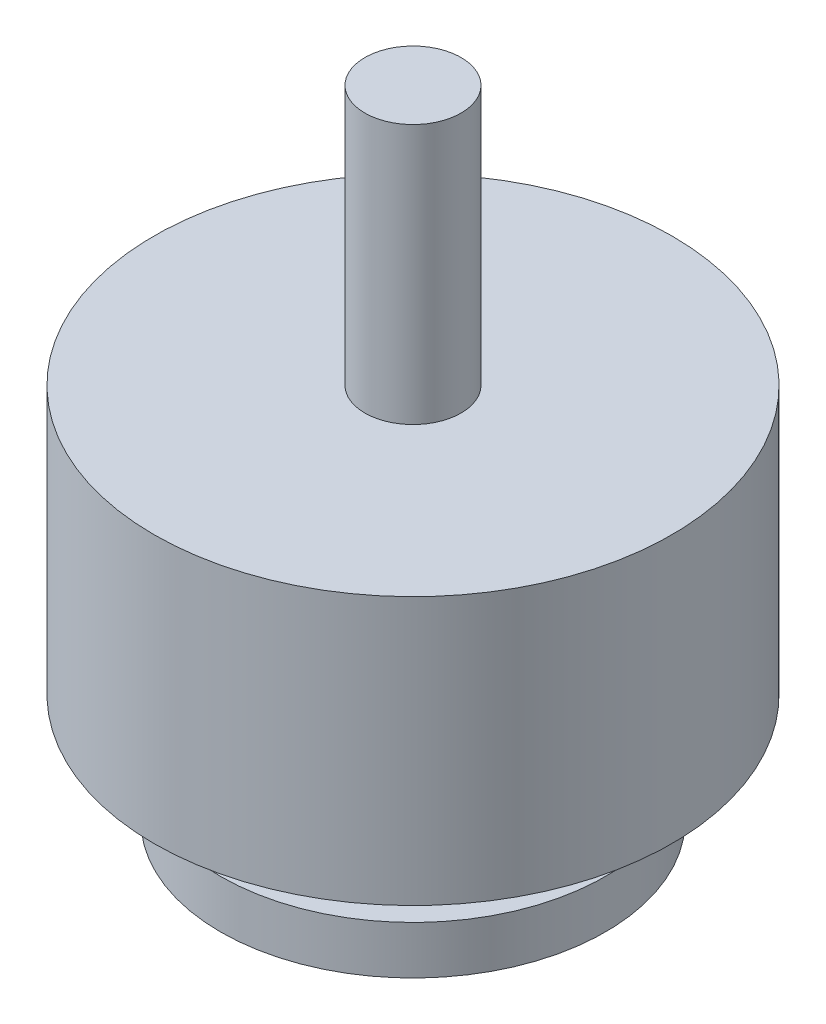
ISO-10303-21;
HEADER;
FILE_DESCRIPTION(('STEP AP214'),'2;1');
FILE_NAME('part.step','',(''),(''),'','','');
FILE_SCHEMA(('AUTOMOTIVE_DESIGN { 1 0 10303 214 1 1 1 1 }'));
ENDSEC;
DATA;
#1=APPLICATION_CONTEXT('core data for automotive mechanical design processes');
#2=APPLICATION_PROTOCOL_DEFINITION('international standard','automotive_design',2000,#1);
#3=PRODUCT_CONTEXT('',#1,'mechanical');
#4=PRODUCT('Part','Part','',(#3));
#5=PRODUCT_RELATED_PRODUCT_CATEGORY('part','',(#4));
#6=PRODUCT_DEFINITION_FORMATION('','',#4);
#7=PRODUCT_DEFINITION_CONTEXT('part definition',#1,'design');
#8=PRODUCT_DEFINITION('design','',#6,#7);
#9=PRODUCT_DEFINITION_SHAPE('','',#8);
#10=(LENGTH_UNIT() NAMED_UNIT(*) SI_UNIT(.MILLI.,.METRE.));
#11=(NAMED_UNIT(*) PLANE_ANGLE_UNIT() SI_UNIT($,.RADIAN.));
#12=(NAMED_UNIT(*) SI_UNIT($,.STERADIAN.) SOLID_ANGLE_UNIT());
#13=UNCERTAINTY_MEASURE_WITH_UNIT(LENGTH_MEASURE(1.E-05),#10,'distance_accuracy_value','');
#14=(GEOMETRIC_REPRESENTATION_CONTEXT(3) GLOBAL_UNCERTAINTY_ASSIGNED_CONTEXT((#13)) GLOBAL_UNIT_ASSIGNED_CONTEXT((#10,
#11,#12)) REPRESENTATION_CONTEXT('',''));
#15=CARTESIAN_POINT('',(0.,0.,0.));
#16=DIRECTION('',(0.,0.,1.));
#17=DIRECTION('',(1.,0.,0.));
#18=AXIS2_PLACEMENT_3D('',#15,#16,#17);
#19=CARTESIAN_POINT('',(0.,13.9,0.));
#20=DIRECTION('',(0.,-1.,0.));
#21=DIRECTION('',(0.,0.,-1.));
#22=AXIS2_PLACEMENT_3D('',#19,#20,#21);
#23=CYLINDRICAL_SURFACE('',#22,13.45);
#24=CARTESIAN_POINT('',(0.,13.9,0.));
#25=DIRECTION('',(0.,1.,0.));
#26=DIRECTION('',(0.,0.,1.));
#27=AXIS2_PLACEMENT_3D('',#24,#25,#26);
#28=CIRCLE('',#27,13.45);
#29=CARTESIAN_POINT('',(0.,13.9,13.45));
#30=VERTEX_POINT('',#29);
#31=EDGE_CURVE('E38',#30,#30,#28,.T.);
#32=ORIENTED_EDGE('',*,*,#31,.F.);
#33=EDGE_LOOP('',(#32));
#34=FACE_BOUND('',#33,.T.);
#35=CARTESIAN_POINT('',(0.,0.,0.));
#36=DIRECTION('',(0.,1.,0.));
#37=DIRECTION('',(0.,0.,1.));
#38=AXIS2_PLACEMENT_3D('',#35,#36,#37);
#39=CIRCLE('',#38,13.45);
#40=CARTESIAN_POINT('',(0.,0.,13.45));
#41=VERTEX_POINT('',#40);
#42=EDGE_CURVE('E34',#41,#41,#39,.T.);
#43=ORIENTED_EDGE('',*,*,#42,.T.);
#44=EDGE_LOOP('',(#43));
#45=FACE_BOUND('',#44,.T.);
#46=ADVANCED_FACE('F31',(#34,#45),#23,.T.);
#47=CARTESIAN_POINT('',(0.,13.9,0.));
#48=DIRECTION('',(0.,1.,0.));
#49=DIRECTION('',(0.,0.,1.));
#50=AXIS2_PLACEMENT_3D('',#47,#48,#49);
#51=PLANE('',#50);
#52=CARTESIAN_POINT('',(0.,13.9,0.));
#53=DIRECTION('',(0.,1.,0.));
#54=DIRECTION('',(0.,0.,1.));
#55=AXIS2_PLACEMENT_3D('',#52,#53,#54);
#56=CIRCLE('',#55,2.5);
#57=CARTESIAN_POINT('',(0.,13.9,2.5));
#58=VERTEX_POINT('',#57);
#59=EDGE_CURVE('E10',#58,#58,#56,.T.);
#60=ORIENTED_EDGE('',*,*,#59,.F.);
#61=EDGE_LOOP('',(#60));
#62=FACE_BOUND('',#61,.T.);
#63=ORIENTED_EDGE('',*,*,#31,.T.);
#64=EDGE_LOOP('',(#63));
#65=FACE_BOUND('',#64,.T.);
#66=ADVANCED_FACE('F90',(#62,#65),#51,.T.);
#67=CARTESIAN_POINT('',(0.,0.,0.));
#68=DIRECTION('',(0.,1.,0.));
#69=DIRECTION('',(0.,0.,1.));
#70=AXIS2_PLACEMENT_3D('',#67,#68,#69);
#71=PLANE('',#70);
#72=CARTESIAN_POINT('',(0.,0.,0.));
#73=DIRECTION('',(0.,1.,0.));
#74=DIRECTION('',(0.,0.,1.));
#75=AXIS2_PLACEMENT_3D('',#72,#73,#74);
#76=CIRCLE('',#75,5.);
#77=CARTESIAN_POINT('',(0.,0.,5.));
#78=VERTEX_POINT('',#77);
#79=EDGE_CURVE('E79',#78,#78,#76,.T.);
#80=ORIENTED_EDGE('',*,*,#79,.T.);
#81=EDGE_LOOP('',(#80));
#82=FACE_BOUND('',#81,.T.);
#83=ORIENTED_EDGE('',*,*,#42,.F.);
#84=EDGE_LOOP('',(#83));
#85=FACE_BOUND('',#84,.T.);
#86=ADVANCED_FACE('F87',(#82,#85),#71,.F.);
#87=CARTESIAN_POINT('',(0.,13.902,0.));
#88=DIRECTION('',(0.,-1.,0.));
#89=DIRECTION('',(0.,0.,-1.));
#90=AXIS2_PLACEMENT_3D('',#87,#88,#89);
#91=CYLINDRICAL_SURFACE('',#90,5.);
#92=CARTESIAN_POINT('',(0.,-3.2,0.));
#93=DIRECTION('',(0.,1.,0.));
#94=DIRECTION('',(0.,0.,1.));
#95=AXIS2_PLACEMENT_3D('',#92,#93,#94);
#96=CIRCLE('',#95,5.);
#97=CARTESIAN_POINT('',(0.,-3.2,5.));
#98=VERTEX_POINT('',#97);
#99=EDGE_CURVE('E74',#98,#98,#96,.T.);
#100=ORIENTED_EDGE('',*,*,#99,.T.);
#101=EDGE_LOOP('',(#100));
#102=FACE_BOUND('',#101,.T.);
#103=ORIENTED_EDGE('',*,*,#79,.F.);
#104=EDGE_LOOP('',(#103));
#105=FACE_BOUND('',#104,.T.);
#106=ADVANCED_FACE('F89',(#102,#105),#91,.T.);
#107=CARTESIAN_POINT('',(0.,-3.2,0.));
#108=DIRECTION('',(0.,-1.,0.));
#109=DIRECTION('',(0.,0.,-1.));
#110=AXIS2_PLACEMENT_3D('',#107,#108,#109);
#111=CYLINDRICAL_SURFACE('',#110,10.);
#112=CARTESIAN_POINT('',(0.,-3.2,0.));
#113=DIRECTION('',(0.,-1.,0.));
#114=DIRECTION('',(0.,0.,-1.));
#115=AXIS2_PLACEMENT_3D('',#112,#113,#114);
#116=CIRCLE('',#115,10.);
#117=CARTESIAN_POINT('',(0.,-3.2,-10.));
#118=VERTEX_POINT('',#117);
#119=EDGE_CURVE('E71',#118,#118,#116,.T.);
#120=ORIENTED_EDGE('',*,*,#119,.T.);
#121=EDGE_LOOP('',(#120));
#122=FACE_BOUND('',#121,.T.);
#123=CARTESIAN_POINT('',(0.,-5.7,0.));
#124=DIRECTION('',(0.,-1.,0.));
#125=DIRECTION('',(0.,0.,-1.));
#126=AXIS2_PLACEMENT_3D('',#123,#124,#125);
#127=CIRCLE('',#126,10.);
#128=CARTESIAN_POINT('',(0.,-5.7,-10.));
#129=VERTEX_POINT('',#128);
#130=EDGE_CURVE('E68',#129,#129,#127,.T.);
#131=ORIENTED_EDGE('',*,*,#130,.F.);
#132=EDGE_LOOP('',(#131));
#133=FACE_BOUND('',#132,.T.);
#134=ADVANCED_FACE('F95',(#122,#133),#111,.T.);
#135=CARTESIAN_POINT('',(0.,-3.2,0.));
#136=DIRECTION('',(0.,-1.,0.));
#137=DIRECTION('',(0.,0.,-1.));
#138=AXIS2_PLACEMENT_3D('',#135,#136,#137);
#139=PLANE('',#138);
#140=ORIENTED_EDGE('',*,*,#99,.F.);
#141=EDGE_LOOP('',(#140));
#142=FACE_BOUND('',#141,.T.);
#143=CARTESIAN_POINT('',(-8.,-3.2,0.));
#144=DIRECTION('',(0.,-1.,0.));
#145=DIRECTION('',(0.,0.,-1.));
#146=AXIS2_PLACEMENT_3D('',#143,#144,#145);
#147=CIRCLE('',#146,1.5);
#148=CARTESIAN_POINT('',(-8.,-3.2,-1.5));
#149=VERTEX_POINT('',#148);
#150=EDGE_CURVE('E46',#149,#149,#147,.T.);
#151=ORIENTED_EDGE('',*,*,#150,.T.);
#152=EDGE_LOOP('',(#151));
#153=FACE_BOUND('',#152,.T.);
#154=CARTESIAN_POINT('',(0.,-3.2,-8.));
#155=DIRECTION('',(0.,-1.,0.));
#156=DIRECTION('',(0.,0.,-1.));
#157=AXIS2_PLACEMENT_3D('',#154,#155,#156);
#158=CIRCLE('',#157,1.5);
#159=CARTESIAN_POINT('',(0.,-3.2,-9.5));
#160=VERTEX_POINT('',#159);
#161=EDGE_CURVE('E53',#160,#160,#158,.T.);
#162=ORIENTED_EDGE('',*,*,#161,.T.);
#163=EDGE_LOOP('',(#162));
#164=FACE_BOUND('',#163,.T.);
#165=CARTESIAN_POINT('',(8.,-3.2,0.));
#166=DIRECTION('',(0.,-1.,0.));
#167=DIRECTION('',(0.,0.,-1.));
#168=AXIS2_PLACEMENT_3D('',#165,#166,#167);
#169=CIRCLE('',#168,1.5);
#170=CARTESIAN_POINT('',(8.,-3.2,-1.5));
#171=VERTEX_POINT('',#170);
#172=EDGE_CURVE('E59',#171,#171,#169,.T.);
#173=ORIENTED_EDGE('',*,*,#172,.T.);
#174=EDGE_LOOP('',(#173));
#175=FACE_BOUND('',#174,.T.);
#176=CARTESIAN_POINT('',(0.,-3.2,8.));
#177=DIRECTION('',(0.,-1.,0.));
#178=DIRECTION('',(0.,0.,-1.));
#179=AXIS2_PLACEMENT_3D('',#176,#177,#178);
#180=CIRCLE('',#179,1.5);
#181=CARTESIAN_POINT('',(0.,-3.2,6.5));
#182=VERTEX_POINT('',#181);
#183=EDGE_CURVE('E65',#182,#182,#180,.T.);
#184=ORIENTED_EDGE('',*,*,#183,.T.);
#185=EDGE_LOOP('',(#184));
#186=FACE_BOUND('',#185,.T.);
#187=ORIENTED_EDGE('',*,*,#119,.F.);
#188=EDGE_LOOP('',(#187));
#189=FACE_BOUND('',#188,.T.);
#190=ADVANCED_FACE('F159',(#142,#153,#164,#175,#186,#189),#139,.F.);
#191=CARTESIAN_POINT('',(0.,-5.7,0.));
#192=DIRECTION('',(0.,-1.,0.));
#193=DIRECTION('',(0.,0.,-1.));
#194=AXIS2_PLACEMENT_3D('',#191,#192,#193);
#195=PLANE('',#194);
#196=CARTESIAN_POINT('',(-8.,-5.7,0.));
#197=DIRECTION('',(0.,-1.,0.));
#198=DIRECTION('',(0.,0.,-1.));
#199=AXIS2_PLACEMENT_3D('',#196,#197,#198);
#200=CIRCLE('',#199,1.5);
#201=CARTESIAN_POINT('',(-8.,-5.7,-1.5));
#202=VERTEX_POINT('',#201);
#203=EDGE_CURVE('E50',#202,#202,#200,.T.);
#204=ORIENTED_EDGE('',*,*,#203,.F.);
#205=EDGE_LOOP('',(#204));
#206=FACE_BOUND('',#205,.T.);
#207=CARTESIAN_POINT('',(0.,-5.7,-8.));
#208=DIRECTION('',(0.,-1.,0.));
#209=DIRECTION('',(0.,0.,-1.));
#210=AXIS2_PLACEMENT_3D('',#207,#208,#209);
#211=CIRCLE('',#210,1.5);
#212=CARTESIAN_POINT('',(0.,-5.7,-9.5));
#213=VERTEX_POINT('',#212);
#214=EDGE_CURVE('E49',#213,#213,#211,.T.);
#215=ORIENTED_EDGE('',*,*,#214,.F.);
#216=EDGE_LOOP('',(#215));
#217=FACE_BOUND('',#216,.T.);
#218=CARTESIAN_POINT('',(8.,-5.7,0.));
#219=DIRECTION('',(0.,-1.,0.));
#220=DIRECTION('',(0.,0.,-1.));
#221=AXIS2_PLACEMENT_3D('',#218,#219,#220);
#222=CIRCLE('',#221,1.5);
#223=CARTESIAN_POINT('',(8.,-5.7,-1.5));
#224=VERTEX_POINT('',#223);
#225=EDGE_CURVE('E56',#224,#224,#222,.T.);
#226=ORIENTED_EDGE('',*,*,#225,.F.);
#227=EDGE_LOOP('',(#226));
#228=FACE_BOUND('',#227,.T.);
#229=CARTESIAN_POINT('',(0.,-5.7,8.));
#230=DIRECTION('',(0.,-1.,0.));
#231=DIRECTION('',(0.,0.,-1.));
#232=AXIS2_PLACEMENT_3D('',#229,#230,#231);
#233=CIRCLE('',#232,1.5);
#234=CARTESIAN_POINT('',(0.,-5.7,6.5));
#235=VERTEX_POINT('',#234);
#236=EDGE_CURVE('E62',#235,#235,#233,.T.);
#237=ORIENTED_EDGE('',*,*,#236,.F.);
#238=EDGE_LOOP('',(#237));
#239=FACE_BOUND('',#238,.T.);
#240=ORIENTED_EDGE('',*,*,#130,.T.);
#241=EDGE_LOOP('',(#240));
#242=FACE_BOUND('',#241,.T.);
#243=ADVANCED_FACE('F157',(#206,#217,#228,#239,#242),#195,.T.);
#244=CARTESIAN_POINT('',(0.,-3.2,8.));
#245=DIRECTION('',(0.,-1.,0.));
#246=DIRECTION('',(0.,0.,-1.));
#247=AXIS2_PLACEMENT_3D('',#244,#245,#246);
#248=CYLINDRICAL_SURFACE('',#247,1.5);
#249=ORIENTED_EDGE('',*,*,#183,.F.);
#250=EDGE_LOOP('',(#249));
#251=FACE_BOUND('',#250,.T.);
#252=ORIENTED_EDGE('',*,*,#236,.T.);
#253=EDGE_LOOP('',(#252));
#254=FACE_BOUND('',#253,.T.);
#255=ADVANCED_FACE('F153',(#251,#254),#248,.F.);
#256=CARTESIAN_POINT('',(8.,-3.2,0.));
#257=DIRECTION('',(0.,-1.,0.));
#258=DIRECTION('',(0.,0.,-1.));
#259=AXIS2_PLACEMENT_3D('',#256,#257,#258);
#260=CYLINDRICAL_SURFACE('',#259,1.5);
#261=ORIENTED_EDGE('',*,*,#172,.F.);
#262=EDGE_LOOP('',(#261));
#263=FACE_BOUND('',#262,.T.);
#264=ORIENTED_EDGE('',*,*,#225,.T.);
#265=EDGE_LOOP('',(#264));
#266=FACE_BOUND('',#265,.T.);
#267=ADVANCED_FACE('F149',(#263,#266),#260,.F.);
#268=CARTESIAN_POINT('',(0.,-3.2,-8.));
#269=DIRECTION('',(0.,-1.,0.));
#270=DIRECTION('',(0.,0.,-1.));
#271=AXIS2_PLACEMENT_3D('',#268,#269,#270);
#272=CYLINDRICAL_SURFACE('',#271,1.5);
#273=ORIENTED_EDGE('',*,*,#161,.F.);
#274=EDGE_LOOP('',(#273));
#275=FACE_BOUND('',#274,.T.);
#276=ORIENTED_EDGE('',*,*,#214,.T.);
#277=EDGE_LOOP('',(#276));
#278=FACE_BOUND('',#277,.T.);
#279=ADVANCED_FACE('F145',(#275,#278),#272,.F.);
#280=CARTESIAN_POINT('',(-8.,-3.2,0.));
#281=DIRECTION('',(0.,-1.,0.));
#282=DIRECTION('',(0.,0.,-1.));
#283=AXIS2_PLACEMENT_3D('',#280,#281,#282);
#284=CYLINDRICAL_SURFACE('',#283,1.5);
#285=ORIENTED_EDGE('',*,*,#150,.F.);
#286=EDGE_LOOP('',(#285));
#287=FACE_BOUND('',#286,.T.);
#288=ORIENTED_EDGE('',*,*,#203,.T.);
#289=EDGE_LOOP('',(#288));
#290=FACE_BOUND('',#289,.T.);
#291=ADVANCED_FACE('F117',(#287,#290),#284,.F.);
#292=CARTESIAN_POINT('',(0.,27.4,0.));
#293=DIRECTION('',(0.,-1.,0.));
#294=DIRECTION('',(0.,0.,-1.));
#295=AXIS2_PLACEMENT_3D('',#292,#293,#294);
#296=CYLINDRICAL_SURFACE('',#295,2.5);
#297=CARTESIAN_POINT('',(0.,27.4,0.));
#298=DIRECTION('',(0.,1.,0.));
#299=DIRECTION('',(0.,0.,1.));
#300=AXIS2_PLACEMENT_3D('',#297,#298,#299);
#301=CIRCLE('',#300,2.5);
#302=CARTESIAN_POINT('',(0.,27.4,2.5));
#303=VERTEX_POINT('',#302);
#304=EDGE_CURVE('E45',#303,#303,#301,.T.);
#305=ORIENTED_EDGE('',*,*,#304,.F.);
#306=EDGE_LOOP('',(#305));
#307=FACE_BOUND('',#306,.T.);
#308=ORIENTED_EDGE('',*,*,#59,.T.);
#309=EDGE_LOOP('',(#308));
#310=FACE_BOUND('',#309,.T.);
#311=ADVANCED_FACE('F122',(#307,#310),#296,.T.);
#312=CARTESIAN_POINT('',(0.,27.4,0.));
#313=DIRECTION('',(0.,1.,0.));
#314=DIRECTION('',(0.,0.,1.));
#315=AXIS2_PLACEMENT_3D('',#312,#313,#314);
#316=PLANE('',#315);
#317=ORIENTED_EDGE('',*,*,#304,.T.);
#318=EDGE_LOOP('',(#317));
#319=FACE_BOUND('',#318,.T.);
#320=ADVANCED_FACE('F127',(#319),#316,.T.);
#321=CLOSED_SHELL('',(#46,#66,#86,#106,#134,#190,#243,#255,#267,#279,#291,#311,#320));
#322=MANIFOLD_SOLID_BREP('B2',#321);
#323=ADVANCED_BREP_SHAPE_REPRESENTATION('',(#18,#322),#14);
#324=SHAPE_DEFINITION_REPRESENTATION(#9,#323);
ENDSEC;
END-ISO-10303-21;
